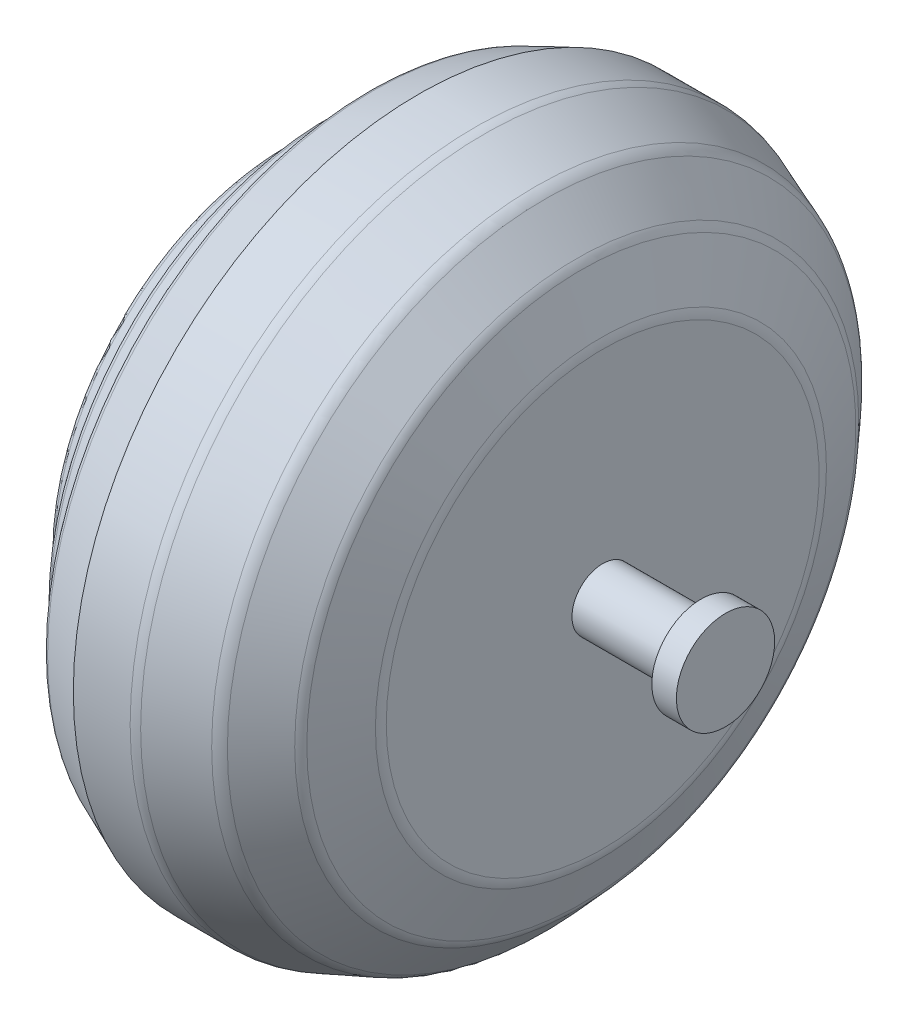
ISO-10303-21;
HEADER;
FILE_DESCRIPTION(('STEP AP214'),'2;1');
FILE_NAME('part.step','',(''),(''),'','','');
FILE_SCHEMA(('AUTOMOTIVE_DESIGN { 1 0 10303 214 1 1 1 1 }'));
ENDSEC;
DATA;
#1=APPLICATION_CONTEXT('core data for automotive mechanical design processes');
#2=APPLICATION_PROTOCOL_DEFINITION('international standard','automotive_design',2000,#1);
#3=PRODUCT_CONTEXT('',#1,'mechanical');
#4=PRODUCT('Part','Part','',(#3));
#5=PRODUCT_RELATED_PRODUCT_CATEGORY('part','',(#4));
#6=PRODUCT_DEFINITION_FORMATION('','',#4);
#7=PRODUCT_DEFINITION_CONTEXT('part definition',#1,'design');
#8=PRODUCT_DEFINITION('design','',#6,#7);
#9=PRODUCT_DEFINITION_SHAPE('','',#8);
#10=(LENGTH_UNIT() NAMED_UNIT(*) SI_UNIT(.MILLI.,.METRE.));
#11=(NAMED_UNIT(*) PLANE_ANGLE_UNIT() SI_UNIT($,.RADIAN.));
#12=(NAMED_UNIT(*) SI_UNIT($,.STERADIAN.) SOLID_ANGLE_UNIT());
#13=UNCERTAINTY_MEASURE_WITH_UNIT(LENGTH_MEASURE(1.E-05),#10,'distance_accuracy_value','');
#14=(GEOMETRIC_REPRESENTATION_CONTEXT(3) GLOBAL_UNCERTAINTY_ASSIGNED_CONTEXT((#13)) GLOBAL_UNIT_ASSIGNED_CONTEXT((#10,
#11,#12)) REPRESENTATION_CONTEXT('',''));
#15=CARTESIAN_POINT('',(0.,0.,0.));
#16=DIRECTION('',(0.,0.,1.));
#17=DIRECTION('',(1.,0.,0.));
#18=AXIS2_PLACEMENT_3D('',#15,#16,#17);
#19=CARTESIAN_POINT('',(113.986464341185,0.,0.));
#20=DIRECTION('',(-1.,0.,0.));
#21=DIRECTION('',(0.,0.,1.));
#22=AXIS2_PLACEMENT_3D('',#19,#20,#21);
#23=TOROIDAL_SURFACE('',#22,122.38809138198,10.);
#24=CARTESIAN_POINT('',(121.382088174693,0.,0.));
#25=DIRECTION('',(-1.,0.,0.));
#26=DIRECTION('',(0.,0.,1.));
#27=AXIS2_PLACEMENT_3D('',#24,#25,#26);
#28=CIRCLE('',#27,129.118971570577);
#29=CARTESIAN_POINT('',(121.382088174693,0.,129.118971570577));
#30=VERTEX_POINT('',#29);
#31=EDGE_CURVE('E123',#30,#30,#28,.T.);
#32=ORIENTED_EDGE('',*,*,#31,.T.);
#33=EDGE_LOOP('',(#32));
#34=FACE_BOUND('',#33,.T.);
#35=CARTESIAN_POINT('',(117.588438460522,0.,0.));
#36=DIRECTION('',(-1.,0.,0.));
#37=DIRECTION('',(0.,0.,1.));
#38=AXIS2_PLACEMENT_3D('',#35,#36,#37);
#39=CIRCLE('',#38,131.716852416738);
#40=CARTESIAN_POINT('',(117.588438460522,0.,131.716852416738));
#41=VERTEX_POINT('',#40);
#42=EDGE_CURVE('E127',#41,#41,#39,.T.);
#43=ORIENTED_EDGE('',*,*,#42,.F.);
#44=EDGE_LOOP('',(#43));
#45=FACE_BOUND('',#44,.T.);
#46=ADVANCED_FACE('F51',(#34,#45),#23,.T.);
#47=CARTESIAN_POINT('',(96.7384433359312,0.,0.));
#48=DIRECTION('',(-1.,0.,0.));
#49=DIRECTION('',(0.,0.,1.));
#50=AXIS2_PLACEMENT_3D('',#47,#48,#49);
#51=CONICAL_SURFACE('',#50,139.767347283877,0.368479501248267);
#52=ORIENTED_EDGE('',*,*,#42,.T.);
#53=EDGE_LOOP('',(#52));
#54=FACE_BOUND('',#53,.T.);
#55=CARTESIAN_POINT('',(96.7384433359312,0.,0.));
#56=DIRECTION('',(-1.,0.,0.));
#57=DIRECTION('',(0.,0.,1.));
#58=AXIS2_PLACEMENT_3D('',#55,#56,#57);
#59=CIRCLE('',#58,139.767347283877);
#60=CARTESIAN_POINT('',(96.7384433359312,0.,139.767347283877));
#61=VERTEX_POINT('',#60);
#62=EDGE_CURVE('E131',#61,#61,#59,.T.);
#63=ORIENTED_EDGE('',*,*,#62,.F.);
#64=EDGE_LOOP('',(#63));
#65=FACE_BOUND('',#64,.T.);
#66=ADVANCED_FACE('F202',(#54,#65),#51,.T.);
#67=CARTESIAN_POINT('',(93.1364692165939,0.,0.));
#68=DIRECTION('',(-1.,0.,0.));
#69=DIRECTION('',(0.,0.,1.));
#70=AXIS2_PLACEMENT_3D('',#67,#68,#69);
#71=TOROIDAL_SURFACE('',#70,130.438586249119,9.99999999999999);
#72=ORIENTED_EDGE('',*,*,#62,.T.);
#73=EDGE_LOOP('',(#72));
#74=FACE_BOUND('',#73,.T.);
#75=CARTESIAN_POINT('',(93.1364692165939,0.,0.));
#76=DIRECTION('',(-1.,0.,0.));
#77=DIRECTION('',(0.,0.,1.));
#78=AXIS2_PLACEMENT_3D('',#75,#76,#77);
#79=CIRCLE('',#78,140.438586249119);
#80=CARTESIAN_POINT('',(93.1364692165939,0.,140.438586249119));
#81=VERTEX_POINT('',#80);
#82=EDGE_CURVE('E99',#81,#81,#79,.T.);
#83=ORIENTED_EDGE('',*,*,#82,.F.);
#84=EDGE_LOOP('',(#83));
#85=FACE_BOUND('',#84,.T.);
#86=ADVANCED_FACE('F203',(#74,#85),#71,.T.);
#87=CARTESIAN_POINT('',(121.382088174693,0.,0.));
#88=DIRECTION('',(-1.,0.,0.));
#89=DIRECTION('',(0.,0.,1.));
#90=AXIS2_PLACEMENT_3D('',#87,#88,#89);
#91=CONICAL_SURFACE('',#90,129.118971570577,0.832419963311123);
#92=CARTESIAN_POINT('',(134.43914749001,0.,0.));
#93=DIRECTION('',(-1.,0.,0.));
#94=DIRECTION('',(0.,0.,1.));
#95=AXIS2_PLACEMENT_3D('',#92,#93,#94);
#96=CIRCLE('',#95,114.7723933576);
#97=CARTESIAN_POINT('',(134.43914749001,0.,114.7723933576));
#98=VERTEX_POINT('',#97);
#99=EDGE_CURVE('E119',#98,#98,#96,.T.);
#100=ORIENTED_EDGE('',*,*,#99,.T.);
#101=EDGE_LOOP('',(#100));
#102=FACE_BOUND('',#101,.T.);
#103=ORIENTED_EDGE('',*,*,#31,.F.);
#104=EDGE_LOOP('',(#103));
#105=FACE_BOUND('',#104,.T.);
#106=ADVANCED_FACE('F206',(#102,#105),#91,.T.);
#107=CARTESIAN_POINT('',(127.043523656502,0.,0.));
#108=DIRECTION('',(-1.,0.,0.));
#109=DIRECTION('',(0.,0.,1.));
#110=AXIS2_PLACEMENT_3D('',#107,#108,#109);
#111=TOROIDAL_SURFACE('',#110,108.041513169003,10.);
#112=CARTESIAN_POINT('',(136.332769552451,0.,0.));
#113=DIRECTION('',(-1.,0.,0.));
#114=DIRECTION('',(0.,0.,1.));
#115=AXIS2_PLACEMENT_3D('',#112,#113,#114);
#116=CIRCLE('',#115,111.744202824454);
#117=CARTESIAN_POINT('',(136.332769552451,0.,111.744202824454));
#118=VERTEX_POINT('',#117);
#119=EDGE_CURVE('E115',#118,#118,#116,.T.);
#120=ORIENTED_EDGE('',*,*,#119,.T.);
#121=EDGE_LOOP('',(#120));
#122=FACE_BOUND('',#121,.T.);
#123=ORIENTED_EDGE('',*,*,#99,.F.);
#124=EDGE_LOOP('',(#123));
#125=FACE_BOUND('',#124,.T.);
#126=ADVANCED_FACE('F250',(#122,#125),#111,.T.);
#127=CARTESIAN_POINT('',(136.332769552451,0.,0.));
#128=DIRECTION('',(-1.,0.,0.));
#129=DIRECTION('',(0.,0.,1.));
#130=AXIS2_PLACEMENT_3D('',#127,#128,#129);
#131=CONICAL_SURFACE('',#130,111.744202824454,1.19149777772099);
#132=CARTESIAN_POINT('',(144.28924589595,0.,0.));
#133=DIRECTION('',(-1.,0.,0.));
#134=DIRECTION('',(0.,0.,1.));
#135=AXIS2_PLACEMENT_3D('',#132,#133,#134);
#136=CIRCLE('',#135,91.7831280119198);
#137=CARTESIAN_POINT('',(144.28924589595,0.,91.7831280119198));
#138=VERTEX_POINT('',#137);
#139=EDGE_CURVE('E111',#138,#138,#136,.T.);
#140=ORIENTED_EDGE('',*,*,#139,.T.);
#141=EDGE_LOOP('',(#140));
#142=FACE_BOUND('',#141,.T.);
#143=ORIENTED_EDGE('',*,*,#119,.F.);
#144=EDGE_LOOP('',(#143));
#145=FACE_BOUND('',#144,.T.);
#146=ADVANCED_FACE('F254',(#142,#145),#131,.T.);
#147=CARTESIAN_POINT('',(135.,0.,0.));
#148=DIRECTION('',(-1.,0.,0.));
#149=DIRECTION('',(0.,0.,1.));
#150=AXIS2_PLACEMENT_3D('',#147,#148,#149);
#151=TOROIDAL_SURFACE('',#150,88.0804383564686,10.);
#152=ORIENTED_EDGE('',*,*,#139,.F.);
#153=EDGE_LOOP('',(#152));
#154=FACE_BOUND('',#153,.T.);
#155=CARTESIAN_POINT('',(145.,0.,0.));
#156=DIRECTION('',(-1.,0.,0.));
#157=DIRECTION('',(0.,0.,1.));
#158=AXIS2_PLACEMENT_3D('',#155,#156,#157);
#159=CIRCLE('',#158,88.0804383564686);
#160=CARTESIAN_POINT('',(145.,0.,88.0804383564686));
#161=VERTEX_POINT('',#160);
#162=EDGE_CURVE('E107',#161,#161,#159,.T.);
#163=ORIENTED_EDGE('',*,*,#162,.T.);
#164=EDGE_LOOP('',(#163));
#165=FACE_BOUND('',#164,.T.);
#166=ADVANCED_FACE('F257',(#154,#165),#151,.T.);
#167=CARTESIAN_POINT('',(145.,0.,0.));
#168=DIRECTION('',(1.,0.,0.));
#169=DIRECTION('',(0.,0.,-1.));
#170=AXIS2_PLACEMENT_3D('',#167,#168,#169);
#171=PLANE('',#170);
#172=CARTESIAN_POINT('',(145.,0.,0.));
#173=DIRECTION('',(1.,0.,0.));
#174=DIRECTION('',(0.,0.,-1.));
#175=AXIS2_PLACEMENT_3D('',#172,#173,#174);
#176=CIRCLE('',#175,12.5);
#177=CARTESIAN_POINT('',(145.,0.,-12.5));
#178=VERTEX_POINT('',#177);
#179=EDGE_CURVE('E136',#178,#178,#176,.T.);
#180=ORIENTED_EDGE('',*,*,#179,.F.);
#181=EDGE_LOOP('',(#180));
#182=FACE_BOUND('',#181,.T.);
#183=ORIENTED_EDGE('',*,*,#162,.F.);
#184=EDGE_LOOP('',(#183));
#185=FACE_BOUND('',#184,.T.);
#186=ADVANCED_FACE('F182',(#182,#185),#171,.T.);
#187=CARTESIAN_POINT('',(15.,0.,0.));
#188=DIRECTION('',(1.,0.,0.));
#189=DIRECTION('',(0.,0.,-1.));
#190=AXIS2_PLACEMENT_3D('',#187,#188,#189);
#191=CONICAL_SURFACE('',#190,95.,0.402417517667305);
#192=CARTESIAN_POINT('',(18.0417805829536,0.,0.));
#193=DIRECTION('',(1.,0.,0.));
#194=DIRECTION('',(0.,0.,-1.));
#195=AXIS2_PLACEMENT_3D('',#192,#193,#194);
#196=CIRCLE('',#195,96.2947211260738);
#197=CARTESIAN_POINT('',(18.0417805829536,0.,-96.2947211260738));
#198=VERTEX_POINT('',#197);
#199=EDGE_CURVE('E87',#198,#198,#196,.T.);
#200=ORIENTED_EDGE('',*,*,#199,.T.);
#201=EDGE_LOOP('',(#200));
#202=FACE_BOUND('',#201,.T.);
#203=CARTESIAN_POINT('',(28.8270288411449,0.,0.));
#204=DIRECTION('',(1.,0.,0.));
#205=DIRECTION('',(0.,0.,-1.));
#206=AXIS2_PLACEMENT_3D('',#203,#204,#205);
#207=CIRCLE('',#206,100.88541673643);
#208=CARTESIAN_POINT('',(28.8270288411449,0.,-100.88541673643));
#209=VERTEX_POINT('',#208);
#210=EDGE_CURVE('E91',#209,#209,#207,.F.);
#211=ORIENTED_EDGE('',*,*,#210,.T.);
#212=EDGE_LOOP('',(#211));
#213=FACE_BOUND('',#212,.T.);
#214=ADVANCED_FACE('F172',(#202,#213),#191,.T.);
#215=CARTESIAN_POINT('',(15.,0.,0.));
#216=DIRECTION('',(1.,0.,0.));
#217=DIRECTION('',(0.,0.,-1.));
#218=AXIS2_PLACEMENT_3D('',#215,#216,#217);
#219=PLANE('',#218);
#220=CARTESIAN_POINT('',(15.,0.,0.));
#221=DIRECTION('',(1.,0.,0.));
#222=DIRECTION('',(0.,0.,-1.));
#223=AXIS2_PLACEMENT_3D('',#220,#221,#222);
#224=CIRCLE('',#223,91.6941367376833);
#225=CARTESIAN_POINT('',(15.,0.,-91.6941367376833));
#226=VERTEX_POINT('',#225);
#227=EDGE_CURVE('E95',#226,#226,#224,.F.);
#228=ORIENTED_EDGE('',*,*,#227,.T.);
#229=EDGE_LOOP('',(#228));
#230=FACE_BOUND('',#229,.T.);
#231=ADVANCED_FACE('F169',(#230),#219,.F.);
#232=CARTESIAN_POINT('',(31.8688094240985,0.,0.));
#233=DIRECTION('',(-1.,0.,0.));
#234=DIRECTION('',(0.,0.,1.));
#235=AXIS2_PLACEMENT_3D('',#232,#233,#234);
#236=PLANE('',#235);
#237=CARTESIAN_POINT('',(31.8688094240985,0.,0.));
#238=DIRECTION('',(-1.,0.,0.));
#239=DIRECTION('',(0.,0.,1.));
#240=AXIS2_PLACEMENT_3D('',#237,#238,#239);
#241=CIRCLE('',#240,105.48600112482);
#242=CARTESIAN_POINT('',(31.8688094240985,0.,105.48600112482));
#243=VERTEX_POINT('',#242);
#244=EDGE_CURVE('E79',#243,#243,#241,.F.);
#245=ORIENTED_EDGE('',*,*,#244,.T.);
#246=EDGE_LOOP('',(#245));
#247=FACE_BOUND('',#246,.T.);
#248=CARTESIAN_POINT('',(31.8688094240985,0.,0.));
#249=DIRECTION('',(-1.,0.,0.));
#250=DIRECTION('',(0.,0.,1.));
#251=AXIS2_PLACEMENT_3D('',#248,#249,#250);
#252=CIRCLE('',#251,110.124274600187);
#253=CARTESIAN_POINT('',(31.8688094240985,0.,110.124274600187));
#254=VERTEX_POINT('',#253);
#255=EDGE_CURVE('E83',#254,#254,#252,.T.);
#256=ORIENTED_EDGE('',*,*,#255,.T.);
#257=EDGE_LOOP('',(#256));
#258=FACE_BOUND('',#257,.T.);
#259=ADVANCED_FACE('F171',(#247,#258),#236,.T.);
#260=CARTESIAN_POINT('',(31.8688094240985,0.,0.));
#261=DIRECTION('',(1.,0.,0.));
#262=DIRECTION('',(0.,0.,-1.));
#263=AXIS2_PLACEMENT_3D('',#260,#261,#262);
#264=CONICAL_SURFACE('',#263,113.430137862503,0.402417517667305);
#265=CARTESIAN_POINT('',(34.9105900070522,0.,0.));
#266=DIRECTION('',(-1.,0.,0.));
#267=DIRECTION('',(0.,0.,1.));
#268=AXIS2_PLACEMENT_3D('',#265,#266,#267);
#269=CIRCLE('',#268,114.724858988577);
#270=CARTESIAN_POINT('',(34.9105900070522,0.,114.724858988577));
#271=VERTEX_POINT('',#270);
#272=EDGE_CURVE('E69',#271,#271,#269,.F.);
#273=ORIENTED_EDGE('',*,*,#272,.T.);
#274=EDGE_LOOP('',(#273));
#275=FACE_BOUND('',#274,.T.);
#276=CARTESIAN_POINT('',(45.6958382652435,0.,0.));
#277=DIRECTION('',(1.,0.,0.));
#278=DIRECTION('',(0.,0.,-1.));
#279=AXIS2_PLACEMENT_3D('',#276,#277,#278);
#280=CIRCLE('',#279,119.315554598933);
#281=CARTESIAN_POINT('',(45.6958382652435,0.,-119.315554598933));
#282=VERTEX_POINT('',#281);
#283=EDGE_CURVE('E75',#282,#282,#280,.F.);
#284=ORIENTED_EDGE('',*,*,#283,.T.);
#285=EDGE_LOOP('',(#284));
#286=FACE_BOUND('',#285,.T.);
#287=ADVANCED_FACE('F179',(#275,#286),#264,.T.);
#288=CARTESIAN_POINT('',(48.737618848197,0.,0.));
#289=DIRECTION('',(-1.,0.,0.));
#290=DIRECTION('',(0.,0.,1.));
#291=AXIS2_PLACEMENT_3D('',#288,#289,#290);
#292=PLANE('',#291);
#293=CARTESIAN_POINT('',(48.737618848197,0.,0.));
#294=DIRECTION('',(-1.,0.,0.));
#295=DIRECTION('',(0.,0.,1.));
#296=AXIS2_PLACEMENT_3D('',#293,#294,#295);
#297=CIRCLE('',#296,123.916138987324);
#298=CARTESIAN_POINT('',(48.737618848197,0.,123.916138987324));
#299=VERTEX_POINT('',#298);
#300=EDGE_CURVE('E59',#299,#299,#297,.F.);
#301=ORIENTED_EDGE('',*,*,#300,.T.);
#302=EDGE_LOOP('',(#301));
#303=FACE_BOUND('',#302,.T.);
#304=CARTESIAN_POINT('',(48.737618848197,0.,0.));
#305=DIRECTION('',(-1.,0.,0.));
#306=DIRECTION('',(0.,0.,1.));
#307=AXIS2_PLACEMENT_3D('',#304,#305,#306);
#308=CIRCLE('',#307,128.082479776576);
#309=CARTESIAN_POINT('',(48.737618848197,0.,128.082479776576));
#310=VERTEX_POINT('',#309);
#311=EDGE_CURVE('E64',#310,#310,#308,.T.);
#312=ORIENTED_EDGE('',*,*,#311,.T.);
#313=EDGE_LOOP('',(#312));
#314=FACE_BOUND('',#313,.T.);
#315=ADVANCED_FACE('F190',(#303,#314),#292,.T.);
#316=CARTESIAN_POINT('',(48.7376188481971,0.,0.));
#317=DIRECTION('',(1.,0.,0.));
#318=DIRECTION('',(0.,0.,-1.));
#319=AXIS2_PLACEMENT_3D('',#316,#317,#318);
#320=CONICAL_SURFACE('',#319,131.388343038893,0.402417517667306);
#321=CARTESIAN_POINT('',(51.7793994311506,0.,0.));
#322=DIRECTION('',(-1.,0.,0.));
#323=DIRECTION('',(0.,0.,1.));
#324=AXIS2_PLACEMENT_3D('',#321,#322,#323);
#325=CIRCLE('',#324,132.683064164967);
#326=CARTESIAN_POINT('',(51.7793994311506,0.,132.683064164967));
#327=VERTEX_POINT('',#326);
#328=EDGE_CURVE('E10',#327,#327,#325,.F.);
#329=ORIENTED_EDGE('',*,*,#328,.T.);
#330=EDGE_LOOP('',(#329));
#331=FACE_BOUND('',#330,.T.);
#332=CARTESIAN_POINT('',(70.0000000000001,0.,0.));
#333=DIRECTION('',(-1.,0.,0.));
#334=DIRECTION('',(0.,0.,1.));
#335=AXIS2_PLACEMENT_3D('',#332,#333,#334);
#336=CIRCLE('',#335,140.438586249119);
#337=CARTESIAN_POINT('',(70.0000000000001,0.,140.438586249119));
#338=VERTEX_POINT('',#337);
#339=EDGE_CURVE('E103',#338,#338,#336,.T.);
#340=ORIENTED_EDGE('',*,*,#339,.T.);
#341=EDGE_LOOP('',(#340));
#342=FACE_BOUND('',#341,.T.);
#343=ADVANCED_FACE('F194',(#331,#342),#320,.T.);
#344=CARTESIAN_POINT('',(-209.218950064021,0.,0.));
#345=DIRECTION('',(-1.,0.,0.));
#346=DIRECTION('',(0.,0.,1.));
#347=AXIS2_PLACEMENT_3D('',#344,#345,#346);
#348=CYLINDRICAL_SURFACE('',#347,140.438586249119);
#349=ORIENTED_EDGE('',*,*,#82,.T.);
#350=EDGE_LOOP('',(#349));
#351=FACE_BOUND('',#350,.T.);
#352=ORIENTED_EDGE('',*,*,#339,.F.);
#353=EDGE_LOOP('',(#352));
#354=FACE_BOUND('',#353,.T.);
#355=ADVANCED_FACE('F197',(#351,#354),#348,.T.);
#356=CARTESIAN_POINT('',(20.,0.,0.));
#357=DIRECTION('',(1.,0.,0.));
#358=DIRECTION('',(0.,0.,-1.));
#359=AXIS2_PLACEMENT_3D('',#356,#357,#358);
#360=TOROIDAL_SURFACE('',#359,91.6941367376833,5.);
#361=ORIENTED_EDGE('',*,*,#199,.F.);
#362=EDGE_LOOP('',(#361));
#363=FACE_BOUND('',#362,.T.);
#364=ORIENTED_EDGE('',*,*,#227,.F.);
#365=EDGE_LOOP('',(#364));
#366=FACE_BOUND('',#365,.T.);
#367=ADVANCED_FACE('F200',(#363,#366),#360,.T.);
#368=CARTESIAN_POINT('',(26.8688094240985,0.,0.));
#369=DIRECTION('',(-1.,0.,0.));
#370=DIRECTION('',(0.,0.,1.));
#371=AXIS2_PLACEMENT_3D('',#368,#369,#370);
#372=TOROIDAL_SURFACE('',#371,105.48600112482,5.);
#373=ORIENTED_EDGE('',*,*,#244,.F.);
#374=EDGE_LOOP('',(#373));
#375=FACE_BOUND('',#374,.T.);
#376=ORIENTED_EDGE('',*,*,#210,.F.);
#377=EDGE_LOOP('',(#376));
#378=FACE_BOUND('',#377,.T.);
#379=ADVANCED_FACE('F210',(#375,#378),#372,.F.);
#380=CARTESIAN_POINT('',(36.8688094240985,0.,0.));
#381=DIRECTION('',(-1.,0.,0.));
#382=DIRECTION('',(0.,0.,1.));
#383=AXIS2_PLACEMENT_3D('',#380,#381,#382);
#384=TOROIDAL_SURFACE('',#383,110.124274600187,5.);
#385=ORIENTED_EDGE('',*,*,#272,.F.);
#386=EDGE_LOOP('',(#385));
#387=FACE_BOUND('',#386,.T.);
#388=ORIENTED_EDGE('',*,*,#255,.F.);
#389=EDGE_LOOP('',(#388));
#390=FACE_BOUND('',#389,.T.);
#391=ADVANCED_FACE('F214',(#387,#390),#384,.T.);
#392=CARTESIAN_POINT('',(43.737618848197,0.,0.));
#393=DIRECTION('',(-1.,0.,0.));
#394=DIRECTION('',(0.,0.,1.));
#395=AXIS2_PLACEMENT_3D('',#392,#393,#394);
#396=TOROIDAL_SURFACE('',#395,123.916138987324,5.);
#397=ORIENTED_EDGE('',*,*,#300,.F.);
#398=EDGE_LOOP('',(#397));
#399=FACE_BOUND('',#398,.T.);
#400=ORIENTED_EDGE('',*,*,#283,.F.);
#401=EDGE_LOOP('',(#400));
#402=FACE_BOUND('',#401,.T.);
#403=ADVANCED_FACE('F217',(#399,#402),#396,.F.);
#404=CARTESIAN_POINT('',(53.737618848197,0.,0.));
#405=DIRECTION('',(-1.,0.,0.));
#406=DIRECTION('',(0.,0.,1.));
#407=AXIS2_PLACEMENT_3D('',#404,#405,#406);
#408=TOROIDAL_SURFACE('',#407,128.082479776576,5.);
#409=ORIENTED_EDGE('',*,*,#328,.F.);
#410=EDGE_LOOP('',(#409));
#411=FACE_BOUND('',#410,.T.);
#412=ORIENTED_EDGE('',*,*,#311,.F.);
#413=EDGE_LOOP('',(#412));
#414=FACE_BOUND('',#413,.T.);
#415=ADVANCED_FACE('F53',(#411,#414),#408,.T.);
#416=CARTESIAN_POINT('',(185.,0.,0.));
#417=DIRECTION('',(-1.,0.,0.));
#418=DIRECTION('',(0.,0.,1.));
#419=AXIS2_PLACEMENT_3D('',#416,#417,#418);
#420=CYLINDRICAL_SURFACE('',#419,12.5);
#421=CARTESIAN_POINT('',(185.,0.,0.));
#422=DIRECTION('',(1.,0.,0.));
#423=DIRECTION('',(0.,0.,-1.));
#424=AXIS2_PLACEMENT_3D('',#421,#422,#423);
#425=CIRCLE('',#424,12.5);
#426=CARTESIAN_POINT('',(185.,0.,-12.5));
#427=VERTEX_POINT('',#426);
#428=EDGE_CURVE('E135',#427,#427,#425,.T.);
#429=ORIENTED_EDGE('',*,*,#428,.F.);
#430=EDGE_LOOP('',(#429));
#431=FACE_BOUND('',#430,.T.);
#432=ORIENTED_EDGE('',*,*,#179,.T.);
#433=EDGE_LOOP('',(#432));
#434=FACE_BOUND('',#433,.T.);
#435=ADVANCED_FACE('F157',(#431,#434),#420,.T.);
#436=CARTESIAN_POINT('',(195.,0.,0.));
#437=DIRECTION('',(-1.,0.,0.));
#438=DIRECTION('',(0.,0.,1.));
#439=AXIS2_PLACEMENT_3D('',#436,#437,#438);
#440=CYLINDRICAL_SURFACE('',#439,20.);
#441=CARTESIAN_POINT('',(195.,0.,0.));
#442=DIRECTION('',(1.,0.,0.));
#443=DIRECTION('',(0.,0.,-1.));
#444=AXIS2_PLACEMENT_3D('',#441,#442,#443);
#445=CIRCLE('',#444,20.);
#446=CARTESIAN_POINT('',(195.,0.,-20.));
#447=VERTEX_POINT('',#446);
#448=EDGE_CURVE('E140',#447,#447,#445,.T.);
#449=ORIENTED_EDGE('',*,*,#448,.F.);
#450=EDGE_LOOP('',(#449));
#451=FACE_BOUND('',#450,.T.);
#452=CARTESIAN_POINT('',(185.,0.,0.));
#453=DIRECTION('',(1.,0.,0.));
#454=DIRECTION('',(0.,0.,-1.));
#455=AXIS2_PLACEMENT_3D('',#452,#453,#454);
#456=CIRCLE('',#455,20.);
#457=CARTESIAN_POINT('',(185.,0.,-20.));
#458=VERTEX_POINT('',#457);
#459=EDGE_CURVE('E144',#458,#458,#456,.T.);
#460=ORIENTED_EDGE('',*,*,#459,.T.);
#461=EDGE_LOOP('',(#460));
#462=FACE_BOUND('',#461,.T.);
#463=ADVANCED_FACE('F154',(#451,#462),#440,.T.);
#464=CARTESIAN_POINT('',(195.,0.,0.));
#465=DIRECTION('',(1.,0.,0.));
#466=DIRECTION('',(0.,0.,-1.));
#467=AXIS2_PLACEMENT_3D('',#464,#465,#466);
#468=PLANE('',#467);
#469=ORIENTED_EDGE('',*,*,#448,.T.);
#470=EDGE_LOOP('',(#469));
#471=FACE_BOUND('',#470,.T.);
#472=ADVANCED_FACE('F152',(#471),#468,.T.);
#473=CARTESIAN_POINT('',(185.,0.,0.));
#474=DIRECTION('',(1.,0.,0.));
#475=DIRECTION('',(0.,0.,-1.));
#476=AXIS2_PLACEMENT_3D('',#473,#474,#475);
#477=PLANE('',#476);
#478=ORIENTED_EDGE('',*,*,#428,.T.);
#479=EDGE_LOOP('',(#478));
#480=FACE_BOUND('',#479,.T.);
#481=ORIENTED_EDGE('',*,*,#459,.F.);
#482=EDGE_LOOP('',(#481));
#483=FACE_BOUND('',#482,.T.);
#484=ADVANCED_FACE('F161',(#480,#483),#477,.F.);
#485=CLOSED_SHELL('',(#46,#66,#86,#106,#126,#146,#166,#186,#214,#231,#259,#287,#315,#343,#355,
#367,#379,#391,#403,#415,#435,#463,#472,#484));
#486=MANIFOLD_SOLID_BREP('B2',#485);
#487=ADVANCED_BREP_SHAPE_REPRESENTATION('',(#18,#486),#14);
#488=SHAPE_DEFINITION_REPRESENTATION(#9,#487);
ENDSEC;
END-ISO-10303-21;
